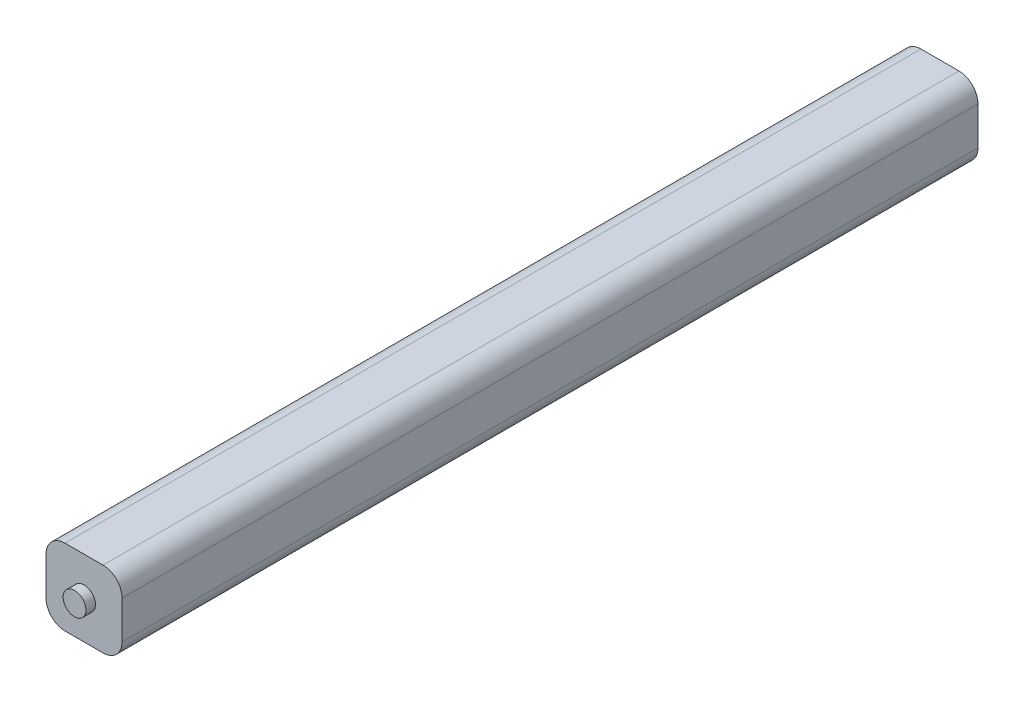
ISO-10303-21;
HEADER;
FILE_DESCRIPTION(('STEP AP214'),'2;1');
FILE_NAME('part.step','',(''),(''),'','','');
FILE_SCHEMA(('AUTOMOTIVE_DESIGN { 1 0 10303 214 1 1 1 1 }'));
ENDSEC;
DATA;
#1=APPLICATION_CONTEXT('core data for automotive mechanical design processes');
#2=APPLICATION_PROTOCOL_DEFINITION('international standard','automotive_design',2000,#1);
#3=PRODUCT_CONTEXT('',#1,'mechanical');
#4=PRODUCT('Part','Part','',(#3));
#5=PRODUCT_RELATED_PRODUCT_CATEGORY('part','',(#4));
#6=PRODUCT_DEFINITION_FORMATION('','',#4);
#7=PRODUCT_DEFINITION_CONTEXT('part definition',#1,'design');
#8=PRODUCT_DEFINITION('design','',#6,#7);
#9=PRODUCT_DEFINITION_SHAPE('','',#8);
#10=(LENGTH_UNIT() NAMED_UNIT(*) SI_UNIT(.MILLI.,.METRE.));
#11=(NAMED_UNIT(*) PLANE_ANGLE_UNIT() SI_UNIT($,.RADIAN.));
#12=(NAMED_UNIT(*) SI_UNIT($,.STERADIAN.) SOLID_ANGLE_UNIT());
#13=UNCERTAINTY_MEASURE_WITH_UNIT(LENGTH_MEASURE(1.E-05),#10,'distance_accuracy_value','');
#14=(GEOMETRIC_REPRESENTATION_CONTEXT(3) GLOBAL_UNCERTAINTY_ASSIGNED_CONTEXT((#13)) GLOBAL_UNIT_ASSIGNED_CONTEXT((#10,
#11,#12)) REPRESENTATION_CONTEXT('',''));
#15=CARTESIAN_POINT('',(0.,0.,0.));
#16=DIRECTION('',(0.,0.,1.));
#17=DIRECTION('',(1.,0.,0.));
#18=AXIS2_PLACEMENT_3D('',#15,#16,#17);
#19=CARTESIAN_POINT('',(0.,0.,230.));
#20=DIRECTION('',(0.,0.,-1.));
#21=DIRECTION('',(-1.,0.,0.));
#22=AXIS2_PLACEMENT_3D('',#19,#20,#21);
#23=CYLINDRICAL_SURFACE('',#22,6.);
#24=CARTESIAN_POINT('',(0.,0.,225.));
#25=DIRECTION('',(0.,0.,1.));
#26=DIRECTION('',(1.,0.,0.));
#27=AXIS2_PLACEMENT_3D('',#24,#25,#26);
#28=CIRCLE('',#27,6.);
#29=CARTESIAN_POINT('',(6.,0.,225.));
#30=VERTEX_POINT('',#29);
#31=EDGE_CURVE('E148',#30,#30,#28,.T.);
#32=ORIENTED_EDGE('',*,*,#31,.T.);
#33=EDGE_LOOP('',(#32));
#34=FACE_BOUND('',#33,.T.);
#35=CARTESIAN_POINT('',(0.,0.,230.));
#36=DIRECTION('',(0.,0.,1.));
#37=DIRECTION('',(1.,0.,0.));
#38=AXIS2_PLACEMENT_3D('',#35,#36,#37);
#39=CIRCLE('',#38,6.);
#40=CARTESIAN_POINT('',(6.,0.,230.));
#41=VERTEX_POINT('',#40);
#42=EDGE_CURVE('E141',#41,#41,#39,.T.);
#43=ORIENTED_EDGE('',*,*,#42,.F.);
#44=EDGE_LOOP('',(#43));
#45=FACE_BOUND('',#44,.T.);
#46=ADVANCED_FACE('F35',(#34,#45),#23,.T.);
#47=CARTESIAN_POINT('',(0.,0.,230.));
#48=DIRECTION('',(0.,0.,1.));
#49=DIRECTION('',(1.,0.,0.));
#50=AXIS2_PLACEMENT_3D('',#47,#48,#49);
#51=PLANE('',#50);
#52=ORIENTED_EDGE('',*,*,#42,.T.);
#53=EDGE_LOOP('',(#52));
#54=FACE_BOUND('',#53,.T.);
#55=ADVANCED_FACE('F202',(#54),#51,.T.);
#56=CARTESIAN_POINT('',(20.,20.,225.));
#57=DIRECTION('',(-1.,0.,0.));
#58=DIRECTION('',(0.,-1.,0.));
#59=AXIS2_PLACEMENT_3D('',#56,#57,#58);
#60=PLANE('',#59);
#61=DIRECTION('',(0.,1.,0.));
#62=VECTOR('',#61,1.);
#63=CARTESIAN_POINT('',(20.,20.,225.));
#64=LINE('',#63,#62);
#65=CARTESIAN_POINT('',(20.,-9.99999999999999,225.));
#66=VERTEX_POINT('',#65);
#67=CARTESIAN_POINT('',(20.,10.,225.));
#68=VERTEX_POINT('',#67);
#69=EDGE_CURVE('E122',#66,#68,#64,.T.);
#70=ORIENTED_EDGE('',*,*,#69,.F.);
#71=DIRECTION('',(0.,0.,-1.));
#72=VECTOR('',#71,1.);
#73=CARTESIAN_POINT('',(20.,-9.99999999999999,225.));
#74=LINE('',#73,#72);
#75=CARTESIAN_POINT('',(20.,-9.99999999999999,-225.));
#76=VERTEX_POINT('',#75);
#77=EDGE_CURVE('E106',#66,#76,#74,.T.);
#78=ORIENTED_EDGE('',*,*,#77,.T.);
#79=DIRECTION('',(0.,1.,0.));
#80=VECTOR('',#79,1.);
#81=CARTESIAN_POINT('',(20.,20.,-225.));
#82=LINE('',#81,#80);
#83=CARTESIAN_POINT('',(20.,10.,-225.));
#84=VERTEX_POINT('',#83);
#85=EDGE_CURVE('E119',#76,#84,#82,.T.);
#86=ORIENTED_EDGE('',*,*,#85,.T.);
#87=DIRECTION('',(0.,0.,-1.));
#88=VECTOR('',#87,1.);
#89=CARTESIAN_POINT('',(20.,10.,225.));
#90=LINE('',#89,#88);
#91=EDGE_CURVE('E124',#84,#68,#90,.F.);
#92=ORIENTED_EDGE('',*,*,#91,.T.);
#93=EDGE_LOOP('',(#70,#78,#86,#92));
#94=FACE_BOUND('',#93,.T.);
#95=ADVANCED_FACE('F118',(#94),#60,.F.);
#96=CARTESIAN_POINT('',(-20.,20.,225.));
#97=DIRECTION('',(0.,-1.,0.));
#98=DIRECTION('',(0.,0.,-1.));
#99=AXIS2_PLACEMENT_3D('',#96,#97,#98);
#100=PLANE('',#99);
#101=DIRECTION('',(-1.,0.,0.));
#102=VECTOR('',#101,1.);
#103=CARTESIAN_POINT('',(-20.,20.,225.));
#104=LINE('',#103,#102);
#105=CARTESIAN_POINT('',(9.99999999999999,20.,225.));
#106=VERTEX_POINT('',#105);
#107=CARTESIAN_POINT('',(-10.,20.,225.));
#108=VERTEX_POINT('',#107);
#109=EDGE_CURVE('E174',#106,#108,#104,.T.);
#110=ORIENTED_EDGE('',*,*,#109,.F.);
#111=DIRECTION('',(0.,0.,-1.));
#112=VECTOR('',#111,1.);
#113=CARTESIAN_POINT('',(9.99999999999999,20.,225.));
#114=LINE('',#113,#112);
#115=CARTESIAN_POINT('',(9.99999999999999,20.,-225.));
#116=VERTEX_POINT('',#115);
#117=EDGE_CURVE('E11',#106,#116,#114,.T.);
#118=ORIENTED_EDGE('',*,*,#117,.T.);
#119=DIRECTION('',(-1.,0.,0.));
#120=VECTOR('',#119,1.);
#121=CARTESIAN_POINT('',(-20.,20.,-225.));
#122=LINE('',#121,#120);
#123=CARTESIAN_POINT('',(-10.,20.,-225.));
#124=VERTEX_POINT('',#123);
#125=EDGE_CURVE('E129',#116,#124,#122,.T.);
#126=ORIENTED_EDGE('',*,*,#125,.T.);
#127=DIRECTION('',(0.,0.,-1.));
#128=VECTOR('',#127,1.);
#129=CARTESIAN_POINT('',(-10.,20.,225.));
#130=LINE('',#129,#128);
#131=EDGE_CURVE('E43',#124,#108,#130,.F.);
#132=ORIENTED_EDGE('',*,*,#131,.T.);
#133=EDGE_LOOP('',(#110,#118,#126,#132));
#134=FACE_BOUND('',#133,.T.);
#135=ADVANCED_FACE('F173',(#134),#100,.F.);
#136=CARTESIAN_POINT('',(-20.,20.,225.));
#137=DIRECTION('',(1.,0.,0.));
#138=DIRECTION('',(0.,0.,-1.));
#139=AXIS2_PLACEMENT_3D('',#136,#137,#138);
#140=PLANE('',#139);
#141=DIRECTION('',(0.,-1.,0.));
#142=VECTOR('',#141,1.);
#143=CARTESIAN_POINT('',(-20.,20.,-225.));
#144=LINE('',#143,#142);
#145=CARTESIAN_POINT('',(-20.,10.,-225.));
#146=VERTEX_POINT('',#145);
#147=CARTESIAN_POINT('',(-20.,-10.,-225.));
#148=VERTEX_POINT('',#147);
#149=EDGE_CURVE('E132',#146,#148,#144,.T.);
#150=ORIENTED_EDGE('',*,*,#149,.T.);
#151=DIRECTION('',(0.,0.,-1.));
#152=VECTOR('',#151,1.);
#153=CARTESIAN_POINT('',(-20.,-10.,225.));
#154=LINE('',#153,#152);
#155=CARTESIAN_POINT('',(-20.,-10.,225.));
#156=VERTEX_POINT('',#155);
#157=EDGE_CURVE('E50',#148,#156,#154,.F.);
#158=ORIENTED_EDGE('',*,*,#157,.T.);
#159=DIRECTION('',(0.,-1.,0.));
#160=VECTOR('',#159,1.);
#161=CARTESIAN_POINT('',(-20.,20.,225.));
#162=LINE('',#161,#160);
#163=CARTESIAN_POINT('',(-20.,10.,225.));
#164=VERTEX_POINT('',#163);
#165=EDGE_CURVE('E180',#164,#156,#162,.T.);
#166=ORIENTED_EDGE('',*,*,#165,.F.);
#167=DIRECTION('',(0.,0.,-1.));
#168=VECTOR('',#167,1.);
#169=CARTESIAN_POINT('',(-20.,10.,225.));
#170=LINE('',#169,#168);
#171=EDGE_CURVE('E167',#164,#146,#170,.T.);
#172=ORIENTED_EDGE('',*,*,#171,.T.);
#173=EDGE_LOOP('',(#150,#158,#166,#172));
#174=FACE_BOUND('',#173,.T.);
#175=ADVANCED_FACE('F184',(#174),#140,.F.);
#176=CARTESIAN_POINT('',(-20.,-20.,225.));
#177=DIRECTION('',(0.,1.,0.));
#178=DIRECTION('',(0.,0.,1.));
#179=AXIS2_PLACEMENT_3D('',#176,#177,#178);
#180=PLANE('',#179);
#181=DIRECTION('',(1.,0.,0.));
#182=VECTOR('',#181,1.);
#183=CARTESIAN_POINT('',(-20.,-20.,-225.));
#184=LINE('',#183,#182);
#185=CARTESIAN_POINT('',(-10.,-20.,-225.));
#186=VERTEX_POINT('',#185);
#187=CARTESIAN_POINT('',(10.,-20.,-225.));
#188=VERTEX_POINT('',#187);
#189=EDGE_CURVE('E139',#186,#188,#184,.T.);
#190=ORIENTED_EDGE('',*,*,#189,.T.);
#191=DIRECTION('',(0.,0.,-1.));
#192=VECTOR('',#191,1.);
#193=CARTESIAN_POINT('',(10.,-20.,225.));
#194=LINE('',#193,#192);
#195=CARTESIAN_POINT('',(10.,-20.,225.));
#196=VERTEX_POINT('',#195);
#197=EDGE_CURVE('E107',#188,#196,#194,.F.);
#198=ORIENTED_EDGE('',*,*,#197,.T.);
#199=DIRECTION('',(1.,0.,0.));
#200=VECTOR('',#199,1.);
#201=CARTESIAN_POINT('',(-20.,-20.,225.));
#202=LINE('',#201,#200);
#203=CARTESIAN_POINT('',(-10.,-20.,225.));
#204=VERTEX_POINT('',#203);
#205=EDGE_CURVE('E135',#204,#196,#202,.T.);
#206=ORIENTED_EDGE('',*,*,#205,.F.);
#207=DIRECTION('',(0.,0.,-1.));
#208=VECTOR('',#207,1.);
#209=CARTESIAN_POINT('',(-10.,-20.,225.));
#210=LINE('',#209,#208);
#211=EDGE_CURVE('E112',#204,#186,#210,.T.);
#212=ORIENTED_EDGE('',*,*,#211,.T.);
#213=EDGE_LOOP('',(#190,#198,#206,#212));
#214=FACE_BOUND('',#213,.T.);
#215=ADVANCED_FACE('F191',(#214),#180,.F.);
#216=CARTESIAN_POINT('',(0.,0.,225.));
#217=DIRECTION('',(0.,0.,1.));
#218=DIRECTION('',(1.,0.,0.));
#219=AXIS2_PLACEMENT_3D('',#216,#217,#218);
#220=PLANE('',#219);
#221=ORIENTED_EDGE('',*,*,#31,.F.);
#222=EDGE_LOOP('',(#221));
#223=FACE_BOUND('',#222,.T.);
#224=ORIENTED_EDGE('',*,*,#205,.T.);
#225=CARTESIAN_POINT('',(10.,-10.,225.));
#226=DIRECTION('',(0.,0.,1.));
#227=DIRECTION('',(1.,0.,0.));
#228=AXIS2_PLACEMENT_3D('',#225,#226,#227);
#229=CIRCLE('',#228,10.);
#230=EDGE_CURVE('E165',#196,#66,#229,.T.);
#231=ORIENTED_EDGE('',*,*,#230,.T.);
#232=ORIENTED_EDGE('',*,*,#69,.T.);
#233=CARTESIAN_POINT('',(9.99999999999999,10.,225.));
#234=DIRECTION('',(0.,0.,1.));
#235=DIRECTION('',(1.,0.,0.));
#236=AXIS2_PLACEMENT_3D('',#233,#234,#235);
#237=CIRCLE('',#236,10.);
#238=EDGE_CURVE('E161',#68,#106,#237,.T.);
#239=ORIENTED_EDGE('',*,*,#238,.T.);
#240=ORIENTED_EDGE('',*,*,#109,.T.);
#241=CARTESIAN_POINT('',(-10.,10.,225.));
#242=DIRECTION('',(0.,0.,1.));
#243=DIRECTION('',(1.,0.,0.));
#244=AXIS2_PLACEMENT_3D('',#241,#242,#243);
#245=CIRCLE('',#244,10.);
#246=EDGE_CURVE('E57',#108,#164,#245,.T.);
#247=ORIENTED_EDGE('',*,*,#246,.T.);
#248=ORIENTED_EDGE('',*,*,#165,.T.);
#249=CARTESIAN_POINT('',(-10.,-10.,225.));
#250=DIRECTION('',(0.,0.,1.));
#251=DIRECTION('',(1.,0.,0.));
#252=AXIS2_PLACEMENT_3D('',#249,#250,#251);
#253=CIRCLE('',#252,10.);
#254=EDGE_CURVE('E163',#156,#204,#253,.T.);
#255=ORIENTED_EDGE('',*,*,#254,.T.);
#256=EDGE_LOOP('',(#224,#231,#232,#239,#240,#247,#248,#255));
#257=FACE_BOUND('',#256,.T.);
#258=ADVANCED_FACE('F178',(#223,#257),#220,.T.);
#259=CARTESIAN_POINT('',(0.,0.,-225.));
#260=DIRECTION('',(0.,0.,1.));
#261=DIRECTION('',(1.,0.,0.));
#262=AXIS2_PLACEMENT_3D('',#259,#260,#261);
#263=PLANE('',#262);
#264=CARTESIAN_POINT('',(0.,0.,-225.));
#265=DIRECTION('',(0.,0.,1.));
#266=DIRECTION('',(1.,0.,0.));
#267=AXIS2_PLACEMENT_3D('',#264,#265,#266);
#268=CIRCLE('',#267,6.);
#269=CARTESIAN_POINT('',(6.,0.,-225.));
#270=VERTEX_POINT('',#269);
#271=EDGE_CURVE('E144',#270,#270,#268,.T.);
#272=ORIENTED_EDGE('',*,*,#271,.T.);
#273=EDGE_LOOP('',(#272));
#274=FACE_BOUND('',#273,.T.);
#275=ORIENTED_EDGE('',*,*,#85,.F.);
#276=CARTESIAN_POINT('',(10.,-10.,-225.));
#277=DIRECTION('',(0.,0.,1.));
#278=DIRECTION('',(1.,0.,0.));
#279=AXIS2_PLACEMENT_3D('',#276,#277,#278);
#280=CIRCLE('',#279,10.);
#281=EDGE_CURVE('E102',#76,#188,#280,.F.);
#282=ORIENTED_EDGE('',*,*,#281,.T.);
#283=ORIENTED_EDGE('',*,*,#189,.F.);
#284=CARTESIAN_POINT('',(-10.,-10.,-225.));
#285=DIRECTION('',(0.,0.,1.));
#286=DIRECTION('',(1.,0.,0.));
#287=AXIS2_PLACEMENT_3D('',#284,#285,#286);
#288=CIRCLE('',#287,10.);
#289=EDGE_CURVE('E113',#186,#148,#288,.F.);
#290=ORIENTED_EDGE('',*,*,#289,.T.);
#291=ORIENTED_EDGE('',*,*,#149,.F.);
#292=CARTESIAN_POINT('',(-10.,10.,-225.));
#293=DIRECTION('',(0.,0.,1.));
#294=DIRECTION('',(1.,0.,0.));
#295=AXIS2_PLACEMENT_3D('',#292,#293,#294);
#296=CIRCLE('',#295,10.);
#297=EDGE_CURVE('E123',#146,#124,#296,.F.);
#298=ORIENTED_EDGE('',*,*,#297,.T.);
#299=ORIENTED_EDGE('',*,*,#125,.F.);
#300=CARTESIAN_POINT('',(9.99999999999999,10.,-225.));
#301=DIRECTION('',(0.,0.,1.));
#302=DIRECTION('',(1.,0.,0.));
#303=AXIS2_PLACEMENT_3D('',#300,#301,#302);
#304=CIRCLE('',#303,10.);
#305=EDGE_CURVE('E128',#116,#84,#304,.F.);
#306=ORIENTED_EDGE('',*,*,#305,.T.);
#307=EDGE_LOOP('',(#275,#282,#283,#290,#291,#298,#299,#306));
#308=FACE_BOUND('',#307,.T.);
#309=ADVANCED_FACE('F126',(#274,#308),#263,.F.);
#310=CARTESIAN_POINT('',(0.,0.,-230.));
#311=DIRECTION('',(0.,0.,1.));
#312=DIRECTION('',(1.,0.,0.));
#313=AXIS2_PLACEMENT_3D('',#310,#311,#312);
#314=PLANE('',#313);
#315=CARTESIAN_POINT('',(0.,0.,-230.));
#316=DIRECTION('',(0.,0.,1.));
#317=DIRECTION('',(1.,0.,0.));
#318=AXIS2_PLACEMENT_3D('',#315,#316,#317);
#319=CIRCLE('',#318,6.);
#320=CARTESIAN_POINT('',(6.,0.,-230.));
#321=VERTEX_POINT('',#320);
#322=EDGE_CURVE('E145',#321,#321,#319,.T.);
#323=ORIENTED_EDGE('',*,*,#322,.F.);
#324=EDGE_LOOP('',(#323));
#325=FACE_BOUND('',#324,.T.);
#326=ADVANCED_FACE('F216',(#325),#314,.F.);
#327=ORIENTED_EDGE('',*,*,#322,.T.);
#328=EDGE_LOOP('',(#327));
#329=FACE_BOUND('',#328,.T.);
#330=ORIENTED_EDGE('',*,*,#271,.F.);
#331=EDGE_LOOP('',(#330));
#332=FACE_BOUND('',#331,.T.);
#333=ADVANCED_FACE('F205',(#329,#332),#23,.T.);
#334=CARTESIAN_POINT('',(10.,-10.,225.));
#335=DIRECTION('',(0.,0.,-1.));
#336=DIRECTION('',(-1.,0.,0.));
#337=AXIS2_PLACEMENT_3D('',#334,#335,#336);
#338=CYLINDRICAL_SURFACE('',#337,10.);
#339=ORIENTED_EDGE('',*,*,#230,.F.);
#340=ORIENTED_EDGE('',*,*,#197,.F.);
#341=ORIENTED_EDGE('',*,*,#281,.F.);
#342=ORIENTED_EDGE('',*,*,#77,.F.);
#343=EDGE_LOOP('',(#339,#340,#341,#342));
#344=FACE_BOUND('',#343,.T.);
#345=ADVANCED_FACE('F105',(#344),#338,.T.);
#346=CARTESIAN_POINT('',(-10.,-10.,225.));
#347=DIRECTION('',(0.,0.,-1.));
#348=DIRECTION('',(-1.,0.,0.));
#349=AXIS2_PLACEMENT_3D('',#346,#347,#348);
#350=CYLINDRICAL_SURFACE('',#349,10.);
#351=ORIENTED_EDGE('',*,*,#254,.F.);
#352=ORIENTED_EDGE('',*,*,#157,.F.);
#353=ORIENTED_EDGE('',*,*,#289,.F.);
#354=ORIENTED_EDGE('',*,*,#211,.F.);
#355=EDGE_LOOP('',(#351,#352,#353,#354));
#356=FACE_BOUND('',#355,.T.);
#357=ADVANCED_FACE('F188',(#356),#350,.T.);
#358=CARTESIAN_POINT('',(9.99999999999999,10.,225.));
#359=DIRECTION('',(0.,0.,-1.));
#360=DIRECTION('',(-1.,0.,0.));
#361=AXIS2_PLACEMENT_3D('',#358,#359,#360);
#362=CYLINDRICAL_SURFACE('',#361,10.);
#363=ORIENTED_EDGE('',*,*,#238,.F.);
#364=ORIENTED_EDGE('',*,*,#91,.F.);
#365=ORIENTED_EDGE('',*,*,#305,.F.);
#366=ORIENTED_EDGE('',*,*,#117,.F.);
#367=EDGE_LOOP('',(#363,#364,#365,#366));
#368=FACE_BOUND('',#367,.T.);
#369=ADVANCED_FACE('F194',(#368),#362,.T.);
#370=CARTESIAN_POINT('',(-10.,10.,225.));
#371=DIRECTION('',(0.,0.,-1.));
#372=DIRECTION('',(-1.,0.,0.));
#373=AXIS2_PLACEMENT_3D('',#370,#371,#372);
#374=CYLINDRICAL_SURFACE('',#373,10.);
#375=ORIENTED_EDGE('',*,*,#246,.F.);
#376=ORIENTED_EDGE('',*,*,#131,.F.);
#377=ORIENTED_EDGE('',*,*,#297,.F.);
#378=ORIENTED_EDGE('',*,*,#171,.F.);
#379=EDGE_LOOP('',(#375,#376,#377,#378));
#380=FACE_BOUND('',#379,.T.);
#381=ADVANCED_FACE('F37',(#380),#374,.T.);
#382=CLOSED_SHELL('',(#46,#55,#95,#135,#175,#215,#258,#309,#326,#333,#345,#357,#369,#381));
#383=MANIFOLD_SOLID_BREP('B2',#382);
#384=ADVANCED_BREP_SHAPE_REPRESENTATION('',(#18,#383),#14);
#385=SHAPE_DEFINITION_REPRESENTATION(#9,#384);
ENDSEC;
END-ISO-10303-21;
